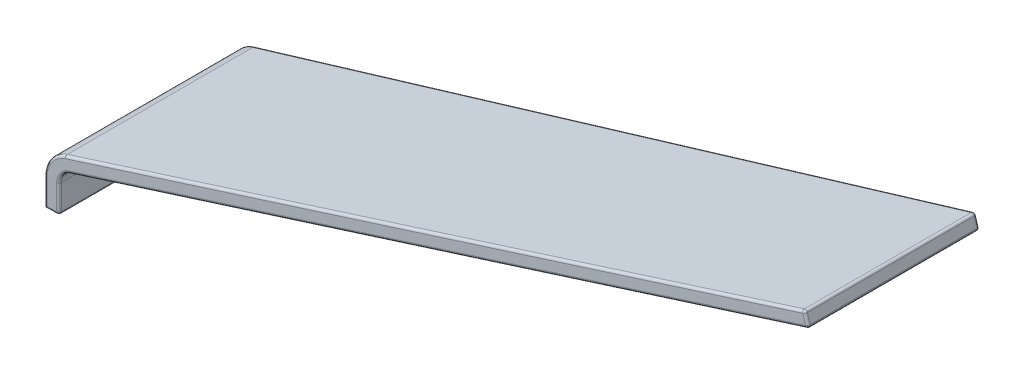
ISO-10303-21;
HEADER;
FILE_DESCRIPTION(('STEP AP214'),'2;1');
FILE_NAME('part.step','',(''),(''),'','','');
FILE_SCHEMA(('AUTOMOTIVE_DESIGN { 1 0 10303 214 1 1 1 1 }'));
ENDSEC;
DATA;
#1=APPLICATION_CONTEXT('core data for automotive mechanical design processes');
#2=APPLICATION_PROTOCOL_DEFINITION('international standard','automotive_design',2000,#1);
#3=PRODUCT_CONTEXT('',#1,'mechanical');
#4=PRODUCT('Part','Part','',(#3));
#5=PRODUCT_RELATED_PRODUCT_CATEGORY('part','',(#4));
#6=PRODUCT_DEFINITION_FORMATION('','',#4);
#7=PRODUCT_DEFINITION_CONTEXT('part definition',#1,'design');
#8=PRODUCT_DEFINITION('design','',#6,#7);
#9=PRODUCT_DEFINITION_SHAPE('','',#8);
#10=(LENGTH_UNIT() NAMED_UNIT(*) SI_UNIT(.MILLI.,.METRE.));
#11=(NAMED_UNIT(*) PLANE_ANGLE_UNIT() SI_UNIT($,.RADIAN.));
#12=(NAMED_UNIT(*) SI_UNIT($,.STERADIAN.) SOLID_ANGLE_UNIT());
#13=UNCERTAINTY_MEASURE_WITH_UNIT(LENGTH_MEASURE(1.E-05),#10,'distance_accuracy_value','');
#14=(GEOMETRIC_REPRESENTATION_CONTEXT(3) GLOBAL_UNCERTAINTY_ASSIGNED_CONTEXT((#13)) GLOBAL_UNIT_ASSIGNED_CONTEXT((#10,
#11,#12)) REPRESENTATION_CONTEXT('',''));
#15=CARTESIAN_POINT('',(0.,0.,0.));
#16=DIRECTION('',(0.,0.,1.));
#17=DIRECTION('',(1.,0.,0.));
#18=AXIS2_PLACEMENT_3D('',#15,#16,#17);
#19=CARTESIAN_POINT('',(-0.25,5.9,-1.94936097891246));
#20=DIRECTION('',(0.,-1.,0.));
#21=DIRECTION('',(1.,0.,0.));
#22=AXIS2_PLACEMENT_3D('',#19,#20,#21);
#23=CYLINDRICAL_SURFACE('',#22,0.05);
#24=CARTESIAN_POINT('',(-0.25,0.,-1.94936097891246));
#25=DIRECTION('',(0.,-1.,0.));
#26=DIRECTION('',(-1.,0.,0.));
#27=AXIS2_PLACEMENT_3D('',#24,#25,#26);
#28=CIRCLE('',#27,0.05);
#29=CARTESIAN_POINT('',(-0.3,0.,-1.94936097891246));
#30=VERTEX_POINT('',#29);
#31=CARTESIAN_POINT('',(-0.249365062062698,0.,-1.99935694728808));
#32=VERTEX_POINT('',#31);
#33=EDGE_CURVE('E337',#30,#32,#28,.T.);
#34=ORIENTED_EDGE('',*,*,#33,.F.);
#35=DIRECTION('',(0.,-1.,0.));
#36=VECTOR('',#35,1.);
#37=CARTESIAN_POINT('',(-0.3,0.,-1.94936097891246));
#38=LINE('',#37,#36);
#39=CARTESIAN_POINT('',(-0.3,0.578874053676874,-1.94936097891246));
#40=VERTEX_POINT('',#39);
#41=EDGE_CURVE('E330',#40,#30,#38,.T.);
#42=ORIENTED_EDGE('',*,*,#41,.F.);
#43=CARTESIAN_POINT('',(-0.25,0.578874053676874,-1.94936097891246));
#44=DIRECTION('',(0.,-1.,0.));
#45=DIRECTION('',(0.,0.,-1.));
#46=AXIS2_PLACEMENT_3D('',#43,#44,#45);
#47=CIRCLE('',#46,0.05);
#48=CARTESIAN_POINT('',(-0.249365062062698,0.578874053676874,-1.99935694728808));
#49=VERTEX_POINT('',#48);
#50=EDGE_CURVE('E11',#40,#49,#47,.T.);
#51=ORIENTED_EDGE('',*,*,#50,.T.);
#52=DIRECTION('',(0.,1.,0.));
#53=VECTOR('',#52,1.);
#54=CARTESIAN_POINT('',(-0.249365062062698,0.578874053676874,-1.99935694728808));
#55=LINE('',#54,#53);
#56=EDGE_CURVE('E290',#32,#49,#55,.T.);
#57=ORIENTED_EDGE('',*,*,#56,.F.);
#58=EDGE_LOOP('',(#34,#42,#51,#57));
#59=FACE_BOUND('',#58,.T.);
#60=ADVANCED_FACE('F17',(#59),#23,.T.);
#61=CARTESIAN_POINT('',(-0.3,0.578874053676874,-1.94936097891246));
#62=CARTESIAN_POINT('',(-0.299999999999999,0.578874053676874,-2.));
#63=CARTESIAN_POINT('',(-0.249365062062698,0.578874053676874,-1.99935694728808));
#64=CARTESIAN_POINT('',(-0.3,0.706065572382144,-1.94936097891022));
#65=CARTESIAN_POINT('',(-0.29999999980723,0.706204949173155,-1.99999999999747));
#66=CARTESIAN_POINT('',(-0.249365061887501,0.695466279156039,-1.99935694728585));
#67=CARTESIAN_POINT('',(-0.25835152249993,0.832610066563799,-1.94887612951393));
#68=CARTESIAN_POINT('',(-0.258315963316391,0.832794241448857,-1.99947062178951));
#69=CARTESIAN_POINT('',(-0.211187291020966,0.811465398823224,-1.99887209788954));
#70=CARTESIAN_POINT('',(-0.107602736688075,1.03712987301596,-1.94712119241854));
#71=CARTESIAN_POINT('',(-0.107308329334465,1.03739358029818,-1.99755285764267));
#72=CARTESIAN_POINT('',(-0.0730009040267693,0.998941888071033,-1.99711716079417));
#73=CARTESIAN_POINT('',(0.000948952192993986,1.11436089565273,-1.94585749145637));
#74=CARTESIAN_POINT('',(0.00130044328543809,1.11460506699489,-1.99617354982449));
#75=CARTESIAN_POINT('',(0.026504807763131,1.06973699103647,-1.99585345987095));
#76=CARTESIAN_POINT('',(0.122443640963793,1.1520003393817,-1.9444431149825));
#77=CARTESIAN_POINT('',(0.123025160813913,1.15218049609387,-1.99462767235518));
#78=CARTESIAN_POINT('',(0.137874942154111,1.10423981557296,-1.99443908335811));
#79=(BOUNDED_SURFACE() B_SPLINE_SURFACE(3,2,((#61,#62,#63),(#64,#65,#66),(#67,#68,#69),(#70,#71,
#72),(#73,#74,#75),(#76,#77,#78)),.UNSPECIFIED.,.F.,.F.,.F.) B_SPLINE_SURFACE_WITH_KNOTS((4,2,
4),(3,3),(0.,0.635185104833467,1.27037020966693),(0.,1.),
.UNSPECIFIED.) GEOMETRIC_REPRESENTATION_ITEM() RATIONAL_B_SPLINE_SURFACE(((1.,0.702602747380758,
1.),(1.,0.702599065790323,1.),(1.,0.70291655171101,1.),(1.,0.704050386956985,1.),(1.,
0.704865043059385,1.),(1.,0.705776909176911,1.))) REPRESENTATION_ITEM('') SURFACE());
#80=CARTESIAN_POINT('',(0.13724000421681,1.10423981557296,-1.9444431149825));
#81=DIRECTION('',(-0.955140199389065,-0.295905493087059,-0.0121300730386369));
#82=DIRECTION('',(0.295927265060347,-0.955210476174703,0.));
#83=AXIS2_PLACEMENT_3D('',#80,#81,#82);
#84=CIRCLE('',#83,0.05);
#85=CARTESIAN_POINT('',(0.122443640963793,1.1520003393817,-1.9444431149825));
#86=VERTEX_POINT('',#85);
#87=CARTESIAN_POINT('',(0.137874942154111,1.10423981557296,-1.99443908335811));
#88=VERTEX_POINT('',#87);
#89=EDGE_CURVE('E26',#86,#88,#84,.T.);
#90=CARTESIAN_POINT('',(-0.249365062062698,0.578874053676874,-1.99935694728808));
#91=CARTESIAN_POINT('',(-0.249365062062699,0.828942346174357,-1.99935694728807));
#92=CARTESIAN_POINT('',(-0.100992910598605,1.03023778969587,-1.99747265319668));
#93=CARTESIAN_POINT('',(0.137874942154111,1.10423981557296,-1.99443908335811));
#94=(BOUNDED_CURVE() B_SPLINE_CURVE(3,(#90,#91,#92,#93),.UNSPECIFIED.,.F.,
.F.) B_SPLINE_CURVE_WITH_KNOTS((4,4),(0.,1.27037020966693),
.UNSPECIFIED.) CURVE() GEOMETRIC_REPRESENTATION_ITEM() RATIONAL_B_SPLINE_CURVE((1.,
0.869974588437781,0.869974588437781,1.)) REPRESENTATION_ITEM(''));
#95=EDGE_CURVE('E291',#49,#88,#94,.T.);
#96=CARTESIAN_POINT('',(-0.3,0.578874053676874,-1.94936097891246));
#97=CARTESIAN_POINT('',(-0.3,0.706065572382144,-1.94936097891022));
#98=CARTESIAN_POINT('',(-0.25835152249993,0.832610066563799,-1.94887612951393));
#99=CARTESIAN_POINT('',(-0.107602736688075,1.03712987301596,-1.94712119241854));
#100=CARTESIAN_POINT('',(0.000948952192993986,1.11436089565273,-1.94585749145637));
#101=CARTESIAN_POINT('',(0.122443640963793,1.1520003393817,-1.9444431149825));
#102=(BOUNDED_CURVE() B_SPLINE_CURVE(3,(#96,#97,#98,#99,#100,#101),.UNSPECIFIED.,.F.,
.F.) B_SPLINE_CURVE_WITH_KNOTS((4,2,4),(0.,0.635185104833467,1.27037020966693),
.UNSPECIFIED.) CURVE() GEOMETRIC_REPRESENTATION_ITEM() RATIONAL_B_SPLINE_CURVE((1.,1.,1.,1.,1.,1.)) REPRESENTATION_ITEM(''));
#103=EDGE_CURVE('E532',#86,#40,#102,.F.);
#104=ORIENTED_EDGE('',*,*,#89,.T.);
#105=ORIENTED_EDGE('',*,*,#95,.F.);
#106=ORIENTED_EDGE('',*,*,#50,.F.);
#107=ORIENTED_EDGE('',*,*,#103,.F.);
#108=EDGE_LOOP('',(#104,#105,#106,#107));
#109=FACE_BOUND('',#108,.T.);
#110=ADVANCED_FACE('F642',(#109),#79,.T.);
#111=CARTESIAN_POINT('',(1.09313702634416,1.40037977476844,-1.9323034304595));
#112=DIRECTION('',(-0.955140199389064,-0.295905493087061,-0.012130073038637));
#113=DIRECTION('',(0.295927265060348,-0.955210476174703,0.));
#114=AXIS2_PLACEMENT_3D('',#111,#112,#113);
#115=CYLINDRICAL_SURFACE('',#114,0.05);
#116=CARTESIAN_POINT('',(15.4153367168871,5.83744311293824,-1.75041460572847));
#117=DIRECTION('',(-0.955140199389077,-0.29590549308702,-0.0121300730386477));
#118=DIRECTION('',(-0.295927265060307,0.955210476174715,0.));
#119=AXIS2_PLACEMENT_3D('',#116,#117,#118);
#120=CIRCLE('',#119,0.05);
#121=CARTESIAN_POINT('',(15.400540353634,5.88520363674698,-1.75041460572847));
#122=VERTEX_POINT('',#121);
#123=CARTESIAN_POINT('',(15.4159716548244,5.83744311293824,-1.80041057410409));
#124=VERTEX_POINT('',#123);
#125=EDGE_CURVE('E364',#122,#124,#120,.T.);
#126=ORIENTED_EDGE('',*,*,#125,.T.);
#127=DIRECTION('',(0.955140199389065,0.295905493087058,0.012130073038637));
#128=VECTOR('',#127,1.);
#129=CARTESIAN_POINT('',(15.463150658783,5.85205931947908,-1.79981141100293));
#130=LINE('',#129,#128);
#131=EDGE_CURVE('E278',#88,#124,#130,.T.);
#132=ORIENTED_EDGE('',*,*,#131,.F.);
#133=ORIENTED_EDGE('',*,*,#89,.F.);
#134=DIRECTION('',(-0.955140199389065,-0.295905493087058,-0.012130073038637));
#135=VECTOR('',#134,1.);
#136=CARTESIAN_POINT('',(0.121862121113672,1.15182018266952,-1.94445050015826));
#137=LINE('',#136,#135);
#138=EDGE_CURVE('E523',#122,#86,#137,.T.);
#139=ORIENTED_EDGE('',*,*,#138,.F.);
#140=EDGE_LOOP('',(#126,#132,#133,#139));
#141=FACE_BOUND('',#140,.T.);
#142=ADVANCED_FACE('F647',(#141),#115,.T.);
#143=CARTESIAN_POINT('',(15.4153367168871,5.83744311293824,-1.75041460572847));
#144=DIRECTION('',(0.,0.,1.));
#145=DIRECTION('',(-0.955210476174704,-0.295927265060344,0.));
#146=AXIS2_PLACEMENT_3D('',#143,#144,#145);
#147=SPHERICAL_SURFACE('',#146,0.05);
#148=CARTESIAN_POINT('',(15.4153367168871,5.83744311293824,-1.75041460572847));
#149=DIRECTION('',(0.,0.,-1.));
#150=DIRECTION('',(-1.,0.,0.));
#151=AXIS2_PLACEMENT_3D('',#148,#149,#150);
#152=CIRCLE('',#151,0.05);
#153=CARTESIAN_POINT('',(15.4630972406958,5.85223947619126,-1.75041460572847));
#154=VERTEX_POINT('',#153);
#155=EDGE_CURVE('E358',#122,#154,#152,.T.);
#156=ORIENTED_EDGE('',*,*,#155,.T.);
#157=CARTESIAN_POINT('',(15.4153367168871,5.83744311293824,-1.75041460572847));
#158=DIRECTION('',(-0.295925175220864,0.955203730474661,-0.00375818543885566));
#159=DIRECTION('',(-0.955210476174704,-0.295927265060344,0.));
#160=AXIS2_PLACEMENT_3D('',#157,#158,#159);
#161=CIRCLE('',#160,0.05);
#162=EDGE_CURVE('E365',#154,#124,#161,.T.);
#163=ORIENTED_EDGE('',*,*,#162,.T.);
#164=ORIENTED_EDGE('',*,*,#125,.F.);
#165=EDGE_LOOP('',(#156,#163,#164));
#166=FACE_BOUND('',#165,.T.);
#167=ADVANCED_FACE('F415',(#166),#147,.T.);
#168=CARTESIAN_POINT('',(15.4153367168871,5.83744311293824,2.));
#169=DIRECTION('',(0.,0.,1.));
#170=DIRECTION('',(1.,0.,0.));
#171=AXIS2_PLACEMENT_3D('',#168,#169,#170);
#172=CYLINDRICAL_SURFACE('',#171,0.05);
#173=CARTESIAN_POINT('',(15.4153367168871,5.83744311293824,1.75041460572847));
#174=DIRECTION('',(0.,0.,-1.));
#175=DIRECTION('',(0.,-1.,0.));
#176=AXIS2_PLACEMENT_3D('',#173,#174,#175);
#177=CIRCLE('',#176,0.05);
#178=CARTESIAN_POINT('',(15.400540353634,5.88520363674698,1.75041460572847));
#179=VERTEX_POINT('',#178);
#180=CARTESIAN_POINT('',(15.4630972406958,5.85223947619126,1.75041460572847));
#181=VERTEX_POINT('',#180);
#182=EDGE_CURVE('E385',#179,#181,#177,.T.);
#183=ORIENTED_EDGE('',*,*,#182,.T.);
#184=DIRECTION('',(0.,0.,1.));
#185=VECTOR('',#184,1.);
#186=CARTESIAN_POINT('',(15.4630972406958,5.85223947619126,2.));
#187=LINE('',#186,#185);
#188=EDGE_CURVE('E272',#154,#181,#187,.T.);
#189=ORIENTED_EDGE('',*,*,#188,.F.);
#190=ORIENTED_EDGE('',*,*,#155,.F.);
#191=DIRECTION('',(0.,0.,-1.));
#192=VECTOR('',#191,1.);
#193=CARTESIAN_POINT('',(15.400540353634,5.88520363674698,2.));
#194=LINE('',#193,#192);
#195=EDGE_CURVE('E670',#179,#122,#194,.T.);
#196=ORIENTED_EDGE('',*,*,#195,.F.);
#197=EDGE_LOOP('',(#183,#189,#190,#196));
#198=FACE_BOUND('',#197,.T.);
#199=ADVANCED_FACE('F693',(#198),#172,.T.);
#200=CARTESIAN_POINT('',(14.0211573614235,10.3376527361837,-1.76812038067287));
#201=DIRECTION('',(-0.295925175220864,0.955203730474661,-0.00375818543884609));
#202=DIRECTION('',(-0.955210476174704,-0.295927265060344,0.));
#203=AXIS2_PLACEMENT_3D('',#200,#201,#202);
#204=CYLINDRICAL_SURFACE('',#203,0.05);
#205=CARTESIAN_POINT('',(15.4745221698991,5.6464010177033,-1.7496629633326));
#206=DIRECTION('',(-0.295925175220848,0.955203730474666,-0.00375818543884923));
#207=DIRECTION('',(0.955210476174709,0.295927265060328,0.));
#208=AXIS2_PLACEMENT_3D('',#205,#206,#207);
#209=CIRCLE('',#208,0.05);
#210=CARTESIAN_POINT('',(15.5222826937079,5.66119738095632,-1.7496629633326));
#211=VERTEX_POINT('',#210);
#212=CARTESIAN_POINT('',(15.4751571078365,5.6464010177033,-1.79965893170822));
#213=VERTEX_POINT('',#212);
#214=EDGE_CURVE('E384',#211,#213,#209,.T.);
#215=ORIENTED_EDGE('',*,*,#214,.T.);
#216=DIRECTION('',(0.295925175220864,-0.955203730474661,0.00375818543884609));
#217=VECTOR('',#216,1.);
#218=CARTESIAN_POINT('',(15.4898985340888,5.59881782259928,-1.79947171879722));
#219=LINE('',#218,#217);
#220=EDGE_CURVE('E273',#124,#213,#219,.T.);
#221=ORIENTED_EDGE('',*,*,#220,.F.);
#222=ORIENTED_EDGE('',*,*,#162,.F.);
#223=DIRECTION('',(-0.295925175220864,0.955203730474661,-0.00375818543884609));
#224=VECTOR('',#223,1.);
#225=CARTESIAN_POINT('',(15.4482459404421,5.9001773287047,-1.75060321401541));
#226=LINE('',#225,#224);
#227=EDGE_CURVE('E262',#211,#154,#226,.T.);
#228=ORIENTED_EDGE('',*,*,#227,.F.);
#229=EDGE_LOOP('',(#215,#221,#222,#228));
#230=FACE_BOUND('',#229,.T.);
#231=ADVANCED_FACE('F696',(#230),#204,.T.);
#232=CARTESIAN_POINT('',(15.4153367168871,5.83744311293824,1.75041460572847));
#233=DIRECTION('',(0.,0.,1.));
#234=DIRECTION('',(-0.955210476174704,-0.295927265060344,0.));
#235=AXIS2_PLACEMENT_3D('',#232,#233,#234);
#236=SPHERICAL_SURFACE('',#235,0.05);
#237=CARTESIAN_POINT('',(15.4153367168871,5.83744311293824,1.75041460572847));
#238=DIRECTION('',(0.955140199389066,0.295905493087056,-0.0121300730386092));
#239=DIRECTION('',(-0.295927265060344,0.955210476174704,0.));
#240=AXIS2_PLACEMENT_3D('',#237,#238,#239);
#241=CIRCLE('',#240,0.05);
#242=CARTESIAN_POINT('',(15.4159716548244,5.83744311293824,1.80041057410409));
#243=VERTEX_POINT('',#242);
#244=EDGE_CURVE('E381',#179,#243,#241,.T.);
#245=ORIENTED_EDGE('',*,*,#244,.T.);
#246=CARTESIAN_POINT('',(15.4153367168871,5.83744311293824,1.75041460572847));
#247=DIRECTION('',(-0.295925175220864,0.955203730474661,0.00375818543884943));
#248=DIRECTION('',(-0.955210476174704,-0.295927265060344,0.));
#249=AXIS2_PLACEMENT_3D('',#246,#247,#248);
#250=CIRCLE('',#249,0.05);
#251=EDGE_CURVE('E377',#243,#181,#250,.T.);
#252=ORIENTED_EDGE('',*,*,#251,.T.);
#253=ORIENTED_EDGE('',*,*,#182,.F.);
#254=EDGE_LOOP('',(#245,#252,#253));
#255=FACE_BOUND('',#254,.T.);
#256=ADVANCED_FACE('F700',(#255),#236,.T.);
#257=CARTESIAN_POINT('',(15.4745221698991,5.6464010177033,-1.7496629633326));
#258=DIRECTION('',(0.,0.,1.));
#259=DIRECTION('',(0.955210476174694,0.295927265060375,0.));
#260=AXIS2_PLACEMENT_3D('',#257,#258,#259);
#261=SPHERICAL_SURFACE('',#260,0.05);
#262=CARTESIAN_POINT('',(15.4745221698991,5.6464010177033,-1.7496629633326));
#263=DIRECTION('',(0.,0.,-1.));
#264=DIRECTION('',(-1.,0.,0.));
#265=AXIS2_PLACEMENT_3D('',#262,#263,#264);
#266=CIRCLE('',#265,0.05);
#267=CARTESIAN_POINT('',(15.5245221698992,5.6464010177033,-1.7496629633326));
#268=VERTEX_POINT('',#267);
#269=EDGE_CURVE('E374',#211,#268,#266,.T.);
#270=ORIENTED_EDGE('',*,*,#269,.T.);
#271=CARTESIAN_POINT('',(15.4745221698991,5.6464010177033,-1.7496629633326));
#272=DIRECTION('',(0.,0.,-1.));
#273=DIRECTION('',(-1.,0.,0.));
#274=AXIS2_PLACEMENT_3D('',#271,#272,#273);
#275=CIRCLE('',#274,0.05);
#276=CARTESIAN_POINT('',(15.4893185331522,5.59864049389457,-1.7496629633326));
#277=VERTEX_POINT('',#276);
#278=EDGE_CURVE('E772',#268,#277,#275,.T.);
#279=ORIENTED_EDGE('',*,*,#278,.T.);
#280=CARTESIAN_POINT('',(15.4745221698991,5.6464010177033,-1.7496629633326));
#281=DIRECTION('',(0.955140199389066,0.295905493087056,0.0121300730385762));
#282=DIRECTION('',(-0.295927265060344,0.955210476174704,0.));
#283=AXIS2_PLACEMENT_3D('',#280,#281,#282);
#284=CIRCLE('',#283,0.05);
#285=EDGE_CURVE('E370',#277,#213,#284,.T.);
#286=ORIENTED_EDGE('',*,*,#285,.T.);
#287=ORIENTED_EDGE('',*,*,#214,.F.);
#288=EDGE_LOOP('',(#270,#279,#286,#287));
#289=FACE_BOUND('',#288,.T.);
#290=ADVANCED_FACE('F704',(#289),#261,.T.);
#291=CARTESIAN_POINT('',(1.09313702634416,1.40037977476844,1.9323034304595));
#292=DIRECTION('',(0.955140199389064,0.295905493087061,-0.012130073038637));
#293=DIRECTION('',(-0.295927265060348,0.955210476174703,0.));
#294=AXIS2_PLACEMENT_3D('',#291,#292,#293);
#295=CYLINDRICAL_SURFACE('',#294,0.05);
#296=CARTESIAN_POINT('',(0.13724000421681,1.10423981557296,1.9444431149825));
#297=DIRECTION('',(0.955140199389065,0.295905493087059,-0.0121300730386369));
#298=DIRECTION('',(-0.295927265060347,0.955210476174703,0.));
#299=AXIS2_PLACEMENT_3D('',#296,#297,#298);
#300=CIRCLE('',#299,0.05);
#301=CARTESIAN_POINT('',(0.122443640963793,1.1520003393817,1.9444431149825));
#302=VERTEX_POINT('',#301);
#303=CARTESIAN_POINT('',(0.137874942154111,1.10423981557296,1.99443908335811));
#304=VERTEX_POINT('',#303);
#305=EDGE_CURVE('E318',#302,#304,#300,.T.);
#306=ORIENTED_EDGE('',*,*,#305,.T.);
#307=DIRECTION('',(-0.955140199389065,-0.295905493087058,0.012130073038637));
#308=VECTOR('',#307,1.);
#309=CARTESIAN_POINT('',(0.13729342230399,1.10405965886078,1.99444646853388));
#310=LINE('',#309,#308);
#311=EDGE_CURVE('E256',#243,#304,#310,.T.);
#312=ORIENTED_EDGE('',*,*,#311,.F.);
#313=ORIENTED_EDGE('',*,*,#244,.F.);
#314=DIRECTION('',(0.955140199389065,0.295905493087058,-0.012130073038637));
#315=VECTOR('',#314,1.);
#316=CARTESIAN_POINT('',(15.4477193575927,5.89981984328782,1.74981544262731));
#317=LINE('',#316,#315);
#318=EDGE_CURVE('E512',#302,#179,#317,.T.);
#319=ORIENTED_EDGE('',*,*,#318,.F.);
#320=EDGE_LOOP('',(#306,#312,#313,#319));
#321=FACE_BOUND('',#320,.T.);
#322=ADVANCED_FACE('F708',(#321),#295,.T.);
#323=CARTESIAN_POINT('',(14.0211573614235,10.3376527361837,1.76812038067287));
#324=DIRECTION('',(0.295925175220864,-0.955203730474661,-0.00375818543884609));
#325=DIRECTION('',(0.955210476174704,0.295927265060344,0.));
#326=AXIS2_PLACEMENT_3D('',#323,#324,#325);
#327=CYLINDRICAL_SURFACE('',#326,0.05);
#328=CARTESIAN_POINT('',(15.4745221698991,5.6464010177033,1.7496629633326));
#329=DIRECTION('',(-0.295925175220864,0.955203730474661,0.00375818543883909));
#330=DIRECTION('',(0.955210476174704,0.295927265060344,0.));
#331=AXIS2_PLACEMENT_3D('',#328,#329,#330);
#332=CIRCLE('',#331,0.05);
#333=CARTESIAN_POINT('',(15.4751571078365,5.6464010177033,1.79965893170822));
#334=VERTEX_POINT('',#333);
#335=CARTESIAN_POINT('',(15.5222826937079,5.66119738095632,1.7496629633326));
#336=VERTEX_POINT('',#335);
#337=EDGE_CURVE('E263',#334,#336,#332,.T.);
#338=ORIENTED_EDGE('',*,*,#337,.T.);
#339=DIRECTION('',(0.295925175220864,-0.955203730474661,-0.00375818543884609));
#340=VECTOR('',#339,1.);
#341=CARTESIAN_POINT('',(15.5370241199602,5.61361418585229,1.74947575042161));
#342=LINE('',#341,#340);
#343=EDGE_CURVE('E282',#181,#336,#342,.T.);
#344=ORIENTED_EDGE('',*,*,#343,.F.);
#345=ORIENTED_EDGE('',*,*,#251,.F.);
#346=DIRECTION('',(-0.295925175220864,0.955203730474661,0.00375818543884609));
#347=VECTOR('',#346,1.);
#348=CARTESIAN_POINT('',(15.4011203545706,5.88538096545169,1.80059918239103));
#349=LINE('',#348,#347);
#350=EDGE_CURVE('E720',#334,#243,#349,.T.);
#351=ORIENTED_EDGE('',*,*,#350,.F.);
#352=EDGE_LOOP('',(#338,#344,#345,#351));
#353=FACE_BOUND('',#352,.T.);
#354=ADVANCED_FACE('F467',(#353),#327,.T.);
#355=CARTESIAN_POINT('',(15.4745221698991,5.6464010177033,2.));
#356=DIRECTION('',(0.,0.,1.));
#357=DIRECTION('',(1.,0.,0.));
#358=AXIS2_PLACEMENT_3D('',#355,#356,#357);
#359=CYLINDRICAL_SURFACE('',#358,0.05);
#360=DIRECTION('',(0.,0.,1.));
#361=VECTOR('',#360,1.);
#362=CARTESIAN_POINT('',(15.5245221698992,5.6464010177033,2.));
#363=LINE('',#362,#361);
#364=CARTESIAN_POINT('',(15.5245221698992,5.6464010177033,1.7496629633326));
#365=VERTEX_POINT('',#364);
#366=EDGE_CURVE('E731',#268,#365,#363,.T.);
#367=ORIENTED_EDGE('',*,*,#366,.F.);
#368=ORIENTED_EDGE('',*,*,#269,.F.);
#369=DIRECTION('',(0.,0.,-1.));
#370=VECTOR('',#369,1.);
#371=CARTESIAN_POINT('',(15.5222826937079,5.66119738095632,2.));
#372=LINE('',#371,#370);
#373=EDGE_CURVE('E258',#336,#211,#372,.T.);
#374=ORIENTED_EDGE('',*,*,#373,.F.);
#375=CARTESIAN_POINT('',(15.4745221698991,5.6464010177033,1.7496629633326));
#376=DIRECTION('',(0.,0.,-1.));
#377=DIRECTION('',(1.,2.25514051876986E-13,0.));
#378=AXIS2_PLACEMENT_3D('',#375,#376,#377);
#379=CIRCLE('',#378,0.05);
#380=EDGE_CURVE('E267',#336,#365,#379,.T.);
#381=ORIENTED_EDGE('',*,*,#380,.T.);
#382=EDGE_LOOP('',(#367,#368,#374,#381));
#383=FACE_BOUND('',#382,.T.);
#384=ADVANCED_FACE('F463',(#383),#359,.T.);
#385=CARTESIAN_POINT('',(1.15231377088728,1.20933498162193,-1.93155189865928));
#386=DIRECTION('',(0.955140199389064,0.295905493087061,0.012130073038637));
#387=DIRECTION('',(-0.295927265060348,0.955210476174703,0.));
#388=AXIS2_PLACEMENT_3D('',#385,#386,#387);
#389=CYLINDRICAL_SURFACE('',#388,0.05);
#390=CARTESIAN_POINT('',(0.196425457228879,0.913197720338019,-1.94369147258663));
#391=DIRECTION('',(0.955140199389065,0.295905493087057,0.0121300730386372));
#392=DIRECTION('',(-0.295927265060346,0.955210476174704,0.));
#393=AXIS2_PLACEMENT_3D('',#390,#391,#392);
#394=CIRCLE('',#393,0.05);
#395=CARTESIAN_POINT('',(0.211221820481897,0.865437196529284,-1.94369147258663));
#396=VERTEX_POINT('',#395);
#397=CARTESIAN_POINT('',(0.197060395166181,0.913197720338019,-1.99368744096224));
#398=VERTEX_POINT('',#397);
#399=EDGE_CURVE('E268',#396,#398,#394,.T.);
#400=ORIENTED_EDGE('',*,*,#399,.T.);
#401=DIRECTION('',(-0.955140199389065,-0.295905493087058,-0.012130073038637));
#402=VECTOR('',#401,1.);
#403=CARTESIAN_POINT('',(0.196483229550532,0.91301891258163,-1.99369477084018));
#404=LINE('',#403,#402);
#405=EDGE_CURVE('E277',#213,#398,#404,.T.);
#406=ORIENTED_EDGE('',*,*,#405,.F.);
#407=ORIENTED_EDGE('',*,*,#285,.F.);
#408=DIRECTION('',(0.955140199389065,0.295905493087058,0.012130073038637));
#409=VECTOR('',#408,1.);
#410=CARTESIAN_POINT('',(15.5365018913453,5.61325804939119,-1.74906374493361));
#411=LINE('',#410,#409);
#412=EDGE_CURVE('E567',#396,#277,#411,.T.);
#413=ORIENTED_EDGE('',*,*,#412,.F.);
#414=EDGE_LOOP('',(#400,#406,#407,#413));
#415=FACE_BOUND('',#414,.T.);
#416=ADVANCED_FACE('F466',(#415),#389,.T.);
#417=CARTESIAN_POINT('',(0.122443640963793,1.1520003393817,1.9444431149825));
#418=CARTESIAN_POINT('',(0.123025160813913,1.15218049609387,1.99462767235518));
#419=CARTESIAN_POINT('',(0.137874942154111,1.10423981557296,1.99443908335811));
#420=CARTESIAN_POINT('',(0.000948952192995531,1.11436089565273,1.94585749145637));
#421=CARTESIAN_POINT('',(0.00130044328542074,1.11460506699494,1.99617354982449));
#422=CARTESIAN_POINT('',(0.0265048077631287,1.06973699103647,1.99585345987095));
#423=CARTESIAN_POINT('',(-0.107602736688076,1.03712987301596,1.94712119241854));
#424=CARTESIAN_POINT('',(-0.107308329334459,1.03739358029817,1.99755285764267));
#425=CARTESIAN_POINT('',(-0.0730009040267655,0.998941888071032,1.99711716079417));
#426=CARTESIAN_POINT('',(-0.25835152249993,0.832610066563799,1.94887612951393));
#427=CARTESIAN_POINT('',(-0.258315963316398,0.832794241448864,1.99947062178951));
#428=CARTESIAN_POINT('',(-0.211187291020971,0.811465398823224,1.99887209788954));
#429=CARTESIAN_POINT('',(-0.3,0.706065572382143,1.94936097891022));
#430=CARTESIAN_POINT('',(-0.299999999807202,0.706204949173147,1.9999999999975));
#431=CARTESIAN_POINT('',(-0.249365061887502,0.69546627915604,1.99935694728585));
#432=CARTESIAN_POINT('',(-0.3,0.578874053676874,1.94936097891246));
#433=CARTESIAN_POINT('',(-0.3,0.578874053676873,2.));
#434=CARTESIAN_POINT('',(-0.249365062062698,0.578874053676874,1.99935694728808));
#435=(BOUNDED_SURFACE() B_SPLINE_SURFACE(3,2,((#417,#418,#419),(#420,#421,#422),(#423,#424,
#425),(#426,#427,#428),(#429,#430,#431),(#432,#433,#434)),.UNSPECIFIED.,.F.,.F.,
.F.) B_SPLINE_SURFACE_WITH_KNOTS((4,2,4),(3,3),(1.87122244392286,2.50640754875633,
3.1415926535898),(0.,1.),
.UNSPECIFIED.) GEOMETRIC_REPRESENTATION_ITEM() RATIONAL_B_SPLINE_SURFACE(((1.,0.70577690917691,
1.),(1.,0.704865043059386,1.),(1.,0.704050386956986,1.),(1.,0.70291655171101,1.),(1.,
0.702599065790326,1.),(1.,0.702602747380757,1.))) REPRESENTATION_ITEM('') SURFACE());
#436=CARTESIAN_POINT('',(-0.25,0.578874053676874,1.94936097891246));
#437=DIRECTION('',(0.,1.,0.));
#438=DIRECTION('',(0.,0.,1.));
#439=AXIS2_PLACEMENT_3D('',#436,#437,#438);
#440=CIRCLE('',#439,0.05);
#441=CARTESIAN_POINT('',(-0.3,0.578874053676874,1.94936097891246));
#442=VERTEX_POINT('',#441);
#443=CARTESIAN_POINT('',(-0.249365062062698,0.578874053676874,1.99935694728808));
#444=VERTEX_POINT('',#443);
#445=EDGE_CURVE('E369',#442,#444,#440,.T.);
#446=CARTESIAN_POINT('',(0.137874942154111,1.10423981557296,1.99443908335811));
#447=CARTESIAN_POINT('',(-0.100992910598605,1.03023778969587,1.99747265319668));
#448=CARTESIAN_POINT('',(-0.249365062062699,0.828942346174357,1.99935694728807));
#449=CARTESIAN_POINT('',(-0.249365062062698,0.578874053676874,1.99935694728808));
#450=(BOUNDED_CURVE() B_SPLINE_CURVE(3,(#446,#447,#448,#449),.UNSPECIFIED.,.F.,
.F.) B_SPLINE_CURVE_WITH_KNOTS((4,4),(1.87122244392286,3.1415926535898),
.UNSPECIFIED.) CURVE() GEOMETRIC_REPRESENTATION_ITEM() RATIONAL_B_SPLINE_CURVE((1.,
0.869974588437781,0.869974588437781,1.)) REPRESENTATION_ITEM(''));
#451=EDGE_CURVE('E253',#304,#444,#450,.T.);
#452=CARTESIAN_POINT('',(0.122443640963793,1.1520003393817,1.9444431149825));
#453=CARTESIAN_POINT('',(0.000948952192995531,1.11436089565273,1.94585749145637));
#454=CARTESIAN_POINT('',(-0.107602736688076,1.03712987301596,1.94712119241854));
#455=CARTESIAN_POINT('',(-0.25835152249993,0.832610066563799,1.94887612951393));
#456=CARTESIAN_POINT('',(-0.3,0.706065572382143,1.94936097891022));
#457=CARTESIAN_POINT('',(-0.3,0.578874053676874,1.94936097891246));
#458=(BOUNDED_CURVE() B_SPLINE_CURVE(3,(#452,#453,#454,#455,#456,#457),.UNSPECIFIED.,.F.,
.F.) B_SPLINE_CURVE_WITH_KNOTS((4,2,4),(1.87122244392286,2.50640754875633,3.1415926535898),
.UNSPECIFIED.) CURVE() GEOMETRIC_REPRESENTATION_ITEM() RATIONAL_B_SPLINE_CURVE((1.,1.,1.,1.,1.,1.)) REPRESENTATION_ITEM(''));
#459=EDGE_CURVE('E563',#442,#302,#458,.F.);
#460=ORIENTED_EDGE('',*,*,#445,.T.);
#461=ORIENTED_EDGE('',*,*,#451,.F.);
#462=ORIENTED_EDGE('',*,*,#305,.F.);
#463=ORIENTED_EDGE('',*,*,#459,.F.);
#464=EDGE_LOOP('',(#460,#461,#462,#463));
#465=FACE_BOUND('',#464,.T.);
#466=ADVANCED_FACE('F461',(#465),#435,.T.);
#467=CARTESIAN_POINT('',(15.4745221698991,5.6464010177033,1.7496629633326));
#468=DIRECTION('',(0.,0.,1.));
#469=DIRECTION('',(0.955210476174694,0.295927265060375,0.));
#470=AXIS2_PLACEMENT_3D('',#467,#468,#469);
#471=SPHERICAL_SURFACE('',#470,0.05);
#472=ORIENTED_EDGE('',*,*,#337,.F.);
#473=CARTESIAN_POINT('',(15.4745221698991,5.6464010177033,1.7496629633326));
#474=DIRECTION('',(0.955140199389044,0.295905493087124,-0.0121300730386473));
#475=DIRECTION('',(-0.295927265060412,0.955210476174683,0.));
#476=AXIS2_PLACEMENT_3D('',#473,#474,#475);
#477=CIRCLE('',#476,0.05);
#478=CARTESIAN_POINT('',(15.4893185331522,5.59864049389457,1.7496629633326));
#479=VERTEX_POINT('',#478);
#480=EDGE_CURVE('E366',#334,#479,#477,.T.);
#481=ORIENTED_EDGE('',*,*,#480,.T.);
#482=CARTESIAN_POINT('',(15.4745221698991,5.6464010177033,1.7496629633326));
#483=DIRECTION('',(0.,0.,-1.));
#484=DIRECTION('',(1.,0.,0.));
#485=AXIS2_PLACEMENT_3D('',#482,#483,#484);
#486=CIRCLE('',#485,0.05);
#487=EDGE_CURVE('E765',#365,#479,#486,.T.);
#488=ORIENTED_EDGE('',*,*,#487,.F.);
#489=ORIENTED_EDGE('',*,*,#380,.F.);
#490=EDGE_LOOP('',(#472,#481,#488,#489));
#491=FACE_BOUND('',#490,.T.);
#492=ADVANCED_FACE('F451',(#491),#471,.T.);
#493=CARTESIAN_POINT('',(-0.0493650620626987,0.578874053676873,-1.99681699073586));
#494=CARTESIAN_POINT('',(0.,0.578874053676872,-1.99619006517167));
#495=CARTESIAN_POINT('',(0.,0.578874053676873,-1.94682102236024));
#496=CARTESIAN_POINT('',(-0.0493650611783317,0.730540905763355,-1.99681699072462));
#497=CARTESIAN_POINT('',(7.70711736560361E-10,0.709189781018328,-1.99619006516193));
#498=CARTESIAN_POINT('',(0.,0.708874216134504,-1.94682102234904));
#499=CARTESIAN_POINT('',(0.0521865838747763,0.868315348643161,-1.99552730689342));
#500=CARTESIAN_POINT('',(0.0877738101632125,0.827466034817703,-1.99507535685048));
#501=CARTESIAN_POINT('',(0.0870442502574118,0.826966587532687,-1.94553133877652));
#502=CARTESIAN_POINT('',(0.197060395166181,0.913197720338019,-1.99368744096224));
#503=CARTESIAN_POINT('',(0.21179898609754,0.865616004285674,-1.99350026405921));
#504=CARTESIAN_POINT('',(0.211221820481897,0.865437196529284,-1.94369147258663));
#505=(BOUNDED_SURFACE() B_SPLINE_SURFACE(3,2,((#493,#494,#495),(#496,#497,#498),(#499,#500,
#501),(#502,#503,#504)),.UNSPECIFIED.,.F.,.F.,.F.) B_SPLINE_SURFACE_WITH_KNOTS((4,4),(3,3),(0.,
1.27037020966693),(0.,1.),
.UNSPECIFIED.) GEOMETRIC_REPRESENTATION_ITEM() RATIONAL_B_SPLINE_SURFACE(((1.,0.711582306815603,
1.),(1.,0.711611183438836,1.),(1.,0.710271938354507,1.),(1.,0.708434156765952,1.))) REPRESENTATION_ITEM('') SURFACE());
#506=CARTESIAN_POINT('',(-0.05,0.578874053676873,-1.94682102236024));
#507=DIRECTION('',(0.,1.,0.));
#508=DIRECTION('',(0.,0.,1.));
#509=AXIS2_PLACEMENT_3D('',#506,#507,#508);
#510=CIRCLE('',#509,0.05);
#511=CARTESIAN_POINT('',(0.,0.578874053676873,-1.94682102236024));
#512=VERTEX_POINT('',#511);
#513=CARTESIAN_POINT('',(-0.0493650620626987,0.578874053676873,-1.99681699073586));
#514=VERTEX_POINT('',#513);
#515=EDGE_CURVE('E51',#512,#514,#510,.T.);
#516=CARTESIAN_POINT('',(0.197060395166181,0.913197720338019,-1.99368744096224));
#517=CARTESIAN_POINT('',(0.0450535797780885,0.866105522052597,-1.99561789449587));
#518=CARTESIAN_POINT('',(-0.0493650620626987,0.738008421629817,-1.99681699073585));
#519=CARTESIAN_POINT('',(-0.0493650620626987,0.578874053676873,-1.99681699073586));
#520=(BOUNDED_CURVE() B_SPLINE_CURVE(3,(#516,#517,#518,#519),.UNSPECIFIED.,.F.,
.F.) B_SPLINE_CURVE_WITH_KNOTS((4,4),(5.01281509751265,6.28318530717959),
.UNSPECIFIED.) CURVE() GEOMETRIC_REPRESENTATION_ITEM() RATIONAL_B_SPLINE_CURVE((1.,
0.869974588437781,0.869974588437781,1.)) REPRESENTATION_ITEM(''));
#521=EDGE_CURVE('E306',#398,#514,#520,.T.);
#522=CARTESIAN_POINT('',(0.211221820481897,0.865437196529284,-1.94369147258663));
#523=CARTESIAN_POINT('',(0.0870442502574118,0.826966587532687,-1.94553133877652));
#524=CARTESIAN_POINT('',(0.,0.708874216134504,-1.94682102234904));
#525=CARTESIAN_POINT('',(0.,0.578874053676873,-1.94682102236024));
#526=(BOUNDED_CURVE() B_SPLINE_CURVE(3,(#522,#523,#524,#525),.UNSPECIFIED.,.F.,
.F.) B_SPLINE_CURVE_WITH_KNOTS((4,4),(0.,1.27037020966693),
.UNSPECIFIED.) CURVE() GEOMETRIC_REPRESENTATION_ITEM() RATIONAL_B_SPLINE_CURVE((1.,1.,1.,1.)) REPRESENTATION_ITEM(''));
#527=EDGE_CURVE('E432',#512,#396,#526,.F.);
#528=ORIENTED_EDGE('',*,*,#515,.T.);
#529=ORIENTED_EDGE('',*,*,#521,.F.);
#530=ORIENTED_EDGE('',*,*,#399,.F.);
#531=ORIENTED_EDGE('',*,*,#527,.F.);
#532=EDGE_LOOP('',(#528,#529,#530,#531));
#533=FACE_BOUND('',#532,.T.);
#534=ADVANCED_FACE('F438',(#533),#505,.T.);
#535=CARTESIAN_POINT('',(-0.25,5.9,1.94936097891246));
#536=DIRECTION('',(0.,1.,0.));
#537=DIRECTION('',(-1.,0.,0.));
#538=AXIS2_PLACEMENT_3D('',#535,#536,#537);
#539=CYLINDRICAL_SURFACE('',#538,0.05);
#540=CARTESIAN_POINT('',(-0.3,0.,1.94999596805051));
#541=CARTESIAN_POINT('',(-0.299624030343212,0.,1.97928287706022));
#542=CARTESIAN_POINT('',(-0.278652022273159,0.0207106781186551,1.99972888532048));
#543=CARTESIAN_POINT('',(-0.249365062062698,0.05,1.99935694728808));
#544=(BOUNDED_CURVE() B_SPLINE_CURVE(3,(#540,#541,#542,#543),.UNSPECIFIED.,.F.,
.F.) B_SPLINE_CURVE_WITH_KNOTS((4,4),(3.1415926535898,4.71238898038468),
.UNSPECIFIED.) CURVE() GEOMETRIC_REPRESENTATION_ITEM() RATIONAL_B_SPLINE_CURVE((1.,
0.804737854124367,0.804737854124367,1.)) REPRESENTATION_ITEM(''));
#545=CARTESIAN_POINT('',(-0.3,0.,1.94999596805051));
#546=VERTEX_POINT('',#545);
#547=CARTESIAN_POINT('',(-0.249365062062698,0.05,1.99935694728808));
#548=VERTEX_POINT('',#547);
#549=EDGE_CURVE('E353',#546,#548,#544,.T.);
#550=ORIENTED_EDGE('',*,*,#549,.T.);
#551=DIRECTION('',(0.,-1.,0.));
#552=VECTOR('',#551,1.);
#553=CARTESIAN_POINT('',(-0.249365062062698,0.,1.99935694728808));
#554=LINE('',#553,#552);
#555=EDGE_CURVE('E246',#444,#548,#554,.T.);
#556=ORIENTED_EDGE('',*,*,#555,.F.);
#557=ORIENTED_EDGE('',*,*,#445,.F.);
#558=DIRECTION('',(0.,1.,0.));
#559=VECTOR('',#558,1.);
#560=CARTESIAN_POINT('',(-0.3,0.578874053676874,1.94936097891246));
#561=LINE('',#560,#559);
#562=CARTESIAN_POINT('',(-0.3,0.,1.94936097891246));
#563=VERTEX_POINT('',#562);
#564=EDGE_CURVE('E329',#563,#442,#561,.T.);
#565=ORIENTED_EDGE('',*,*,#564,.F.);
#566=DIRECTION('',(0.,0.,-1.));
#567=VECTOR('',#566,1.);
#568=CARTESIAN_POINT('',(-0.3,0.,2.));
#569=LINE('',#568,#567);
#570=EDGE_CURVE('E324',#546,#563,#569,.T.);
#571=ORIENTED_EDGE('',*,*,#570,.F.);
#572=EDGE_LOOP('',(#550,#556,#557,#565,#571));
#573=FACE_BOUND('',#572,.T.);
#574=ADVANCED_FACE('F450',(#573),#539,.T.);
#575=CARTESIAN_POINT('',(1.15231377088728,1.20933498162193,1.93155189865928));
#576=DIRECTION('',(-0.955140199389064,-0.295905493087061,0.012130073038637));
#577=DIRECTION('',(0.295927265060348,-0.955210476174703,0.));
#578=AXIS2_PLACEMENT_3D('',#575,#576,#577);
#579=CYLINDRICAL_SURFACE('',#578,0.05);
#580=CARTESIAN_POINT('',(0.196425457228879,0.913197720338019,1.94369147258663));
#581=DIRECTION('',(0.955140199389065,0.295905493087057,-0.0121300730386372));
#582=DIRECTION('',(-0.295927265060346,0.955210476174704,0.));
#583=AXIS2_PLACEMENT_3D('',#580,#581,#582);
#584=CIRCLE('',#583,0.05);
#585=CARTESIAN_POINT('',(0.197060395166181,0.913197720338019,1.99368744096224));
#586=VERTEX_POINT('',#585);
#587=CARTESIAN_POINT('',(0.211221820481897,0.865437196529284,1.94369147258663));
#588=VERTEX_POINT('',#587);
#589=EDGE_CURVE('E336',#586,#588,#584,.T.);
#590=ORIENTED_EDGE('',*,*,#589,.T.);
#591=DIRECTION('',(-0.955140199389065,-0.295905493087058,0.012130073038637));
#592=VECTOR('',#591,1.);
#593=CARTESIAN_POINT('',(0.210644654866253,0.865258388772895,1.94369880246456));
#594=LINE('',#593,#592);
#595=EDGE_CURVE('E344',#479,#588,#594,.T.);
#596=ORIENTED_EDGE('',*,*,#595,.F.);
#597=ORIENTED_EDGE('',*,*,#480,.F.);
#598=DIRECTION('',(0.955140199389065,0.295905493087058,-0.012130073038637));
#599=VECTOR('',#598,1.);
#600=CARTESIAN_POINT('',(15.5223404660296,5.66101857319993,1.79905971330922));
#601=LINE('',#600,#599);
#602=EDGE_CURVE('E516',#586,#334,#601,.T.);
#603=ORIENTED_EDGE('',*,*,#602,.F.);
#604=EDGE_LOOP('',(#590,#596,#597,#603));
#605=FACE_BOUND('',#604,.T.);
#606=ADVANCED_FACE('F452',(#605),#579,.T.);
#607=CARTESIAN_POINT('',(-0.05,5.9,-1.94682102236024));
#608=DIRECTION('',(0.,1.,0.));
#609=DIRECTION('',(0.,0.,1.));
#610=AXIS2_PLACEMENT_3D('',#607,#608,#609);
#611=CYLINDRICAL_SURFACE('',#610,0.05);
#612=CARTESIAN_POINT('',(0.,0.05,-1.94682102236024));
#613=CARTESIAN_POINT('',(0.,0.0210047218329217,-1.97581630052731));
#614=CARTESIAN_POINT('',(-0.0203721726622848,0.00037220533579222,-1.99644881702445));
#615=CARTESIAN_POINT('',(-0.0493650620626987,0.,-1.99681699073586));
#616=(BOUNDED_CURVE() B_SPLINE_CURVE(3,(#612,#613,#614,#615),.UNSPECIFIED.,.F.,
.F.) B_SPLINE_CURVE_WITH_KNOTS((4,4),(1.5707963267949,3.12889457724808),
.UNSPECIFIED.) CURVE() GEOMETRIC_REPRESENTATION_ITEM() RATIONAL_B_SPLINE_CURVE((1.,
0.807721298119402,0.807721298119402,1.)) REPRESENTATION_ITEM(''));
#617=CARTESIAN_POINT('',(0.,0.05,-1.94682102236024));
#618=VERTEX_POINT('',#617);
#619=CARTESIAN_POINT('',(-0.0493650620626987,0.,-1.99681699073586));
#620=VERTEX_POINT('',#619);
#621=EDGE_CURVE('E331',#618,#620,#616,.T.);
#622=ORIENTED_EDGE('',*,*,#621,.T.);
#623=DIRECTION('',(0.,-1.,0.));
#624=VECTOR('',#623,1.);
#625=CARTESIAN_POINT('',(-0.0493650620626987,0.,-1.99681699073586));
#626=LINE('',#625,#624);
#627=EDGE_CURVE('E307',#514,#620,#626,.T.);
#628=ORIENTED_EDGE('',*,*,#627,.F.);
#629=ORIENTED_EDGE('',*,*,#515,.F.);
#630=DIRECTION('',(0.,1.,0.));
#631=VECTOR('',#630,1.);
#632=CARTESIAN_POINT('',(0.,0.578874053676875,-1.94682102236024));
#633=LINE('',#632,#631);
#634=EDGE_CURVE('E323',#618,#512,#633,.T.);
#635=ORIENTED_EDGE('',*,*,#634,.F.);
#636=EDGE_LOOP('',(#622,#628,#629,#635));
#637=FACE_BOUND('',#636,.T.);
#638=ADVANCED_FACE('F628',(#637),#611,.T.);
#639=CARTESIAN_POINT('',(-0.3006349379373,0.05,1.95000403162438));
#640=DIRECTION('',(-0.999919367512356,0.,0.0126987587460259));
#641=DIRECTION('',(0.0126987587460259,0.,0.999919367512356));
#642=AXIS2_PLACEMENT_3D('',#639,#640,#641);
#643=CYLINDRICAL_SURFACE('',#642,0.05);
#644=CARTESIAN_POINT('',(-0.05,0.05,1.94682102236024));
#645=DIRECTION('',(-0.999919367512356,0.,0.0126987587460258));
#646=DIRECTION('',(-0.0126987587460258,0.,-0.999919367512356));
#647=AXIS2_PLACEMENT_3D('',#644,#645,#646);
#648=CIRCLE('',#647,0.05);
#649=CARTESIAN_POINT('',(-0.05,0.,1.94682102236024));
#650=VERTEX_POINT('',#649);
#651=CARTESIAN_POINT('',(-0.0493650620626987,0.05,1.99681699073586));
#652=VERTEX_POINT('',#651);
#653=EDGE_CURVE('E211',#650,#652,#648,.T.);
#654=ORIENTED_EDGE('',*,*,#653,.T.);
#655=DIRECTION('',(0.999919367512356,0.,-0.0126987587460257));
#656=VECTOR('',#655,1.);
#657=CARTESIAN_POINT('',(0.,0.05,1.99619006517167));
#658=LINE('',#657,#656);
#659=EDGE_CURVE('E215',#548,#652,#658,.T.);
#660=ORIENTED_EDGE('',*,*,#659,.F.);
#661=ORIENTED_EDGE('',*,*,#549,.F.);
#662=DIRECTION('',(-0.999919367512356,0.,0.0126987587460257));
#663=VECTOR('',#662,1.);
#664=CARTESIAN_POINT('',(-0.300634937937301,0.,1.95000403162438));
#665=LINE('',#664,#663);
#666=EDGE_CURVE('E218',#650,#546,#665,.T.);
#667=ORIENTED_EDGE('',*,*,#666,.F.);
#668=EDGE_LOOP('',(#654,#660,#661,#667));
#669=FACE_BOUND('',#668,.T.);
#670=ADVANCED_FACE('F213',(#669),#643,.T.);
#671=CARTESIAN_POINT('',(0.197060395166181,0.913197720338019,1.99368744096224));
#672=CARTESIAN_POINT('',(0.21179898609754,0.865616004285674,1.99350026405921));
#673=CARTESIAN_POINT('',(0.211221820481897,0.865437196529284,1.94369147258663));
#674=CARTESIAN_POINT('',(0.052186583874777,0.868315348643161,1.99552730689342));
#675=CARTESIAN_POINT('',(0.0877738101631918,0.827466034817766,1.99507535685031));
#676=CARTESIAN_POINT('',(0.0870442502574118,0.826966587532687,1.94553133877652));
#677=CARTESIAN_POINT('',(-0.0493650611783321,0.730540905763355,1.99681699072462));
#678=CARTESIAN_POINT('',(7.70724811059107E-10,0.70918978101828,1.99619006516186));
#679=CARTESIAN_POINT('',(0.,0.708874216134504,1.94682102234904));
#680=CARTESIAN_POINT('',(-0.0493650620626987,0.578874053676873,1.99681699073586));
#681=CARTESIAN_POINT('',(0.,0.578874053676872,1.99619006517167));
#682=CARTESIAN_POINT('',(0.,0.578874053676873,1.94682102236024));
#683=(BOUNDED_SURFACE() B_SPLINE_SURFACE(3,2,((#671,#672,#673),(#674,#675,#676),(#677,#678,
#679),(#680,#681,#682)),.UNSPECIFIED.,.F.,.F.,.F.) B_SPLINE_SURFACE_WITH_KNOTS((4,4),(3,3),
(1.87122244392286,3.1415926535898),(0.,1.),
.UNSPECIFIED.) GEOMETRIC_REPRESENTATION_ITEM() RATIONAL_B_SPLINE_SURFACE(((1.,0.708434156765952,
1.),(1.,0.710271938354511,1.),(1.,0.711611183438833,1.),(1.,0.711582306815602,1.))) REPRESENTATION_ITEM('') SURFACE());
#684=CARTESIAN_POINT('',(-0.05,0.578874053676873,1.94682102236024));
#685=DIRECTION('',(0.,1.,0.));
#686=DIRECTION('',(0.,0.,1.));
#687=AXIS2_PLACEMENT_3D('',#684,#685,#686);
#688=CIRCLE('',#687,0.05);
#689=CARTESIAN_POINT('',(-0.0493650620626987,0.578874053676873,1.99681699073586));
#690=VERTEX_POINT('',#689);
#691=CARTESIAN_POINT('',(0.,0.578874053676873,1.94682102236024));
#692=VERTEX_POINT('',#691);
#693=EDGE_CURVE('E40',#690,#692,#688,.T.);
#694=CARTESIAN_POINT('',(0.,0.578874053676873,1.94682102236024));
#695=CARTESIAN_POINT('',(0.,0.708874216134504,1.94682102234904));
#696=CARTESIAN_POINT('',(0.0870442502574118,0.826966587532687,1.94553133877652));
#697=CARTESIAN_POINT('',(0.211221820481897,0.865437196529284,1.94369147258663));
#698=(BOUNDED_CURVE() B_SPLINE_CURVE(3,(#694,#695,#696,#697),.UNSPECIFIED.,.F.,
.F.) B_SPLINE_CURVE_WITH_KNOTS((4,4),(1.87122244392286,3.1415926535898),
.UNSPECIFIED.) CURVE() GEOMETRIC_REPRESENTATION_ITEM() RATIONAL_B_SPLINE_CURVE((1.,1.,1.,1.)) REPRESENTATION_ITEM(''));
#699=EDGE_CURVE('E232',#588,#692,#698,.F.);
#700=CARTESIAN_POINT('',(-0.0493650620626987,0.578874053676873,1.99681699073586));
#701=CARTESIAN_POINT('',(-0.0493650620626987,0.738008421629817,1.99681699073585));
#702=CARTESIAN_POINT('',(0.0450535797780883,0.866105522052597,1.99561789449587));
#703=CARTESIAN_POINT('',(0.197060395166181,0.913197720338019,1.99368744096224));
#704=(BOUNDED_CURVE() B_SPLINE_CURVE(3,(#700,#701,#702,#703),.UNSPECIFIED.,.F.,
.F.) B_SPLINE_CURVE_WITH_KNOTS((4,4),(3.1415926535898,4.41196286325672),
.UNSPECIFIED.) CURVE() GEOMETRIC_REPRESENTATION_ITEM() RATIONAL_B_SPLINE_CURVE((1.,
0.869974588437781,0.869974588437781,1.)) REPRESENTATION_ITEM(''));
#705=EDGE_CURVE('E240',#690,#586,#704,.T.);
#706=ORIENTED_EDGE('',*,*,#693,.T.);
#707=ORIENTED_EDGE('',*,*,#699,.F.);
#708=ORIENTED_EDGE('',*,*,#589,.F.);
#709=ORIENTED_EDGE('',*,*,#705,.F.);
#710=EDGE_LOOP('',(#706,#707,#708,#709));
#711=FACE_BOUND('',#710,.T.);
#712=ADVANCED_FACE('F616',(#711),#683,.T.);
#713=CARTESIAN_POINT('',(-0.05,0.05,2.));
#714=DIRECTION('',(0.,0.,-1.));
#715=DIRECTION('',(-1.,0.,0.));
#716=AXIS2_PLACEMENT_3D('',#713,#714,#715);
#717=CYLINDRICAL_SURFACE('',#716,0.05);
#718=DIRECTION('',(0.,0.,1.));
#719=VECTOR('',#718,1.);
#720=CARTESIAN_POINT('',(-0.05,0.,2.));
#721=LINE('',#720,#719);
#722=CARTESIAN_POINT('',(-0.05,0.,-1.99682505430973));
#723=VERTEX_POINT('',#722);
#724=EDGE_CURVE('E343',#723,#650,#721,.T.);
#725=ORIENTED_EDGE('',*,*,#724,.F.);
#726=DIRECTION('',(-0.999919367512356,0.,-0.0126987587460227));
#727=VECTOR('',#726,1.);
#728=CARTESIAN_POINT('',(0.,0.,-1.99619006517167));
#729=LINE('',#728,#727);
#730=EDGE_CURVE('E311',#620,#723,#729,.T.);
#731=ORIENTED_EDGE('',*,*,#730,.F.);
#732=ORIENTED_EDGE('',*,*,#621,.F.);
#733=DIRECTION('',(0.,0.,-1.));
#734=VECTOR('',#733,1.);
#735=CARTESIAN_POINT('',(0.,0.05,2.));
#736=LINE('',#735,#734);
#737=CARTESIAN_POINT('',(0.,0.05,1.94682102236024));
#738=VERTEX_POINT('',#737);
#739=EDGE_CURVE('E319',#738,#618,#736,.T.);
#740=ORIENTED_EDGE('',*,*,#739,.F.);
#741=CARTESIAN_POINT('',(-0.05,0.05,1.94682102236024));
#742=DIRECTION('',(0.,0.,-1.));
#743=DIRECTION('',(1.,0.,0.));
#744=AXIS2_PLACEMENT_3D('',#741,#742,#743);
#745=CIRCLE('',#744,0.05);
#746=EDGE_CURVE('E222',#738,#650,#745,.T.);
#747=ORIENTED_EDGE('',*,*,#746,.T.);
#748=EDGE_LOOP('',(#725,#731,#732,#740,#747));
#749=FACE_BOUND('',#748,.T.);
#750=ADVANCED_FACE('F413',(#749),#717,.T.);
#751=CARTESIAN_POINT('',(-0.05,0.05,1.94682102236024));
#752=DIRECTION('',(0.,0.,1.));
#753=DIRECTION('',(1.,0.,0.));
#754=AXIS2_PLACEMENT_3D('',#751,#752,#753);
#755=SPHERICAL_SURFACE('',#754,0.05);
#756=ORIENTED_EDGE('',*,*,#653,.F.);
#757=ORIENTED_EDGE('',*,*,#746,.F.);
#758=CARTESIAN_POINT('',(-0.05,0.05,1.94682102236024));
#759=DIRECTION('',(0.,-1.,0.));
#760=DIRECTION('',(0.,0.,-1.));
#761=AXIS2_PLACEMENT_3D('',#758,#759,#760);
#762=CIRCLE('',#761,0.05);
#763=EDGE_CURVE('E225',#738,#652,#762,.T.);
#764=ORIENTED_EDGE('',*,*,#763,.T.);
#765=EDGE_LOOP('',(#756,#757,#764));
#766=FACE_BOUND('',#765,.T.);
#767=ADVANCED_FACE('F227',(#766),#755,.T.);
#768=CARTESIAN_POINT('',(-0.05,5.9,1.94682102236024));
#769=DIRECTION('',(0.,-1.,0.));
#770=DIRECTION('',(0.,0.,-1.));
#771=AXIS2_PLACEMENT_3D('',#768,#769,#770);
#772=CYLINDRICAL_SURFACE('',#771,0.05);
#773=ORIENTED_EDGE('',*,*,#763,.F.);
#774=DIRECTION('',(0.,-1.,0.));
#775=VECTOR('',#774,1.);
#776=CARTESIAN_POINT('',(0.,0.,1.94682102236024));
#777=LINE('',#776,#775);
#778=EDGE_CURVE('E587',#692,#738,#777,.T.);
#779=ORIENTED_EDGE('',*,*,#778,.F.);
#780=ORIENTED_EDGE('',*,*,#693,.F.);
#781=DIRECTION('',(0.,1.,0.));
#782=VECTOR('',#781,1.);
#783=CARTESIAN_POINT('',(-0.0493650620626987,0.578874053676875,1.99681699073586));
#784=LINE('',#783,#782);
#785=EDGE_CURVE('E235',#652,#690,#784,.T.);
#786=ORIENTED_EDGE('',*,*,#785,.F.);
#787=EDGE_LOOP('',(#773,#779,#780,#786));
#788=FACE_BOUND('',#787,.T.);
#789=ADVANCED_FACE('F236',(#788),#772,.T.);
#790=CARTESIAN_POINT('',(0.3,0.578874053676873,2.));
#791=DIRECTION('',(0.,0.,-1.));
#792=DIRECTION('',(-1.,0.,0.));
#793=AXIS2_PLACEMENT_3D('',#790,#791,#792);
#794=CYLINDRICAL_SURFACE('',#793,0.3);
#795=DIRECTION('',(0.,0.,1.));
#796=VECTOR('',#795,1.);
#797=CARTESIAN_POINT('',(0.,0.578874053676873,1.99619006517167));
#798=LINE('',#797,#796);
#799=EDGE_CURVE('E579',#512,#692,#798,.T.);
#800=ORIENTED_EDGE('',*,*,#799,.F.);
#801=ORIENTED_EDGE('',*,*,#527,.T.);
#802=DIRECTION('',(0.,0.,-1.));
#803=VECTOR('',#802,1.);
#804=CARTESIAN_POINT('',(0.211221820481897,0.865437196529284,-1.99619006517167));
#805=LINE('',#804,#803);
#806=EDGE_CURVE('E500',#588,#396,#805,.T.);
#807=ORIENTED_EDGE('',*,*,#806,.F.);
#808=ORIENTED_EDGE('',*,*,#699,.T.);
#809=EDGE_LOOP('',(#800,#801,#807,#808));
#810=FACE_BOUND('',#809,.T.);
#811=ADVANCED_FACE('F402',(#810),#794,.F.);
#812=CARTESIAN_POINT('',(0.3,0.578874053676874,2.));
#813=DIRECTION('',(0.,0.,-1.));
#814=DIRECTION('',(-1.,0.,0.));
#815=AXIS2_PLACEMENT_3D('',#812,#813,#814);
#816=CYLINDRICAL_SURFACE('',#815,0.6);
#817=DIRECTION('',(0.,0.,1.));
#818=VECTOR('',#817,1.);
#819=CARTESIAN_POINT('',(0.122443640963793,1.1520003393817,2.));
#820=LINE('',#819,#818);
#821=EDGE_CURVE('E517',#86,#302,#820,.T.);
#822=ORIENTED_EDGE('',*,*,#821,.F.);
#823=ORIENTED_EDGE('',*,*,#103,.T.);
#824=DIRECTION('',(0.,0.,-1.));
#825=VECTOR('',#824,1.);
#826=CARTESIAN_POINT('',(-0.3,0.578874053676874,2.));
#827=LINE('',#826,#825);
#828=EDGE_CURVE('E315',#442,#40,#827,.T.);
#829=ORIENTED_EDGE('',*,*,#828,.F.);
#830=ORIENTED_EDGE('',*,*,#459,.T.);
#831=EDGE_LOOP('',(#822,#823,#829,#830));
#832=FACE_BOUND('',#831,.T.);
#833=ADVANCED_FACE('F412',(#832),#816,.T.);
#834=CARTESIAN_POINT('',(0.,0.,2.));
#835=DIRECTION('',(-1.,0.,0.));
#836=DIRECTION('',(0.,0.,1.));
#837=AXIS2_PLACEMENT_3D('',#834,#835,#836);
#838=PLANE('',#837);
#839=ORIENTED_EDGE('',*,*,#739,.T.);
#840=ORIENTED_EDGE('',*,*,#634,.T.);
#841=ORIENTED_EDGE('',*,*,#799,.T.);
#842=ORIENTED_EDGE('',*,*,#778,.T.);
#843=EDGE_LOOP('',(#839,#840,#841,#842));
#844=FACE_BOUND('',#843,.T.);
#845=ADVANCED_FACE('F548',(#844),#838,.F.);
#846=CARTESIAN_POINT('',(0.,0.,2.));
#847=DIRECTION('',(0.,1.,0.));
#848=DIRECTION('',(1.,0.,0.));
#849=AXIS2_PLACEMENT_3D('',#846,#847,#848);
#850=PLANE('',#849);
#851=DIRECTION('',(0.,0.,-1.));
#852=VECTOR('',#851,1.);
#853=CARTESIAN_POINT('',(-0.3,0.,2.));
#854=LINE('',#853,#852);
#855=EDGE_CURVE('E325',#563,#30,#854,.T.);
#856=ORIENTED_EDGE('',*,*,#855,.T.);
#857=ORIENTED_EDGE('',*,*,#33,.T.);
#858=DIRECTION('',(-0.999919367512356,0.,-0.0126987587460227));
#859=VECTOR('',#858,1.);
#860=CARTESIAN_POINT('',(0.,0.,-1.99619006517167));
#861=LINE('',#860,#859);
#862=EDGE_CURVE('E286',#723,#32,#861,.T.);
#863=ORIENTED_EDGE('',*,*,#862,.F.);
#864=ORIENTED_EDGE('',*,*,#724,.T.);
#865=ORIENTED_EDGE('',*,*,#666,.T.);
#866=ORIENTED_EDGE('',*,*,#570,.T.);
#867=EDGE_LOOP('',(#856,#857,#863,#864,#865,#866));
#868=FACE_BOUND('',#867,.T.);
#869=ADVANCED_FACE('F655',(#868),#850,.F.);
#870=CARTESIAN_POINT('',(0.,0.8,2.));
#871=DIRECTION('',(-0.295927265060346,0.955210476174704,0.));
#872=DIRECTION('',(0.,0.,1.));
#873=AXIS2_PLACEMENT_3D('',#870,#871,#872);
#874=PLANE('',#873);
#875=ORIENTED_EDGE('',*,*,#806,.T.);
#876=ORIENTED_EDGE('',*,*,#412,.T.);
#877=DIRECTION('',(0.,0.,1.));
#878=VECTOR('',#877,1.);
#879=CARTESIAN_POINT('',(15.4893185331522,5.59864049389457,2.));
#880=LINE('',#879,#878);
#881=EDGE_CURVE('E769',#277,#479,#880,.T.);
#882=ORIENTED_EDGE('',*,*,#881,.T.);
#883=ORIENTED_EDGE('',*,*,#595,.T.);
#884=EDGE_LOOP('',(#875,#876,#882,#883));
#885=FACE_BOUND('',#884,.T.);
#886=ADVANCED_FACE('F820',(#885),#874,.F.);
#887=CARTESIAN_POINT('',(-0.3,1.02112594632313,2.));
#888=DIRECTION('',(1.,0.,0.));
#889=DIRECTION('',(0.,1.,0.));
#890=AXIS2_PLACEMENT_3D('',#887,#888,#889);
#891=PLANE('',#890);
#892=ORIENTED_EDGE('',*,*,#828,.T.);
#893=ORIENTED_EDGE('',*,*,#41,.T.);
#894=ORIENTED_EDGE('',*,*,#855,.F.);
#895=ORIENTED_EDGE('',*,*,#564,.T.);
#896=EDGE_LOOP('',(#892,#893,#894,#895));
#897=FACE_BOUND('',#896,.T.);
#898=ADVANCED_FACE('F549',(#897),#891,.F.);
#899=CARTESIAN_POINT('',(-0.3,5.9,-2.));
#900=DIRECTION('',(0.0126987587460257,0.,-0.999919367512356));
#901=DIRECTION('',(0.,-1.,0.));
#902=AXIS2_PLACEMENT_3D('',#899,#900,#901);
#903=PLANE('',#902);
#904=ORIENTED_EDGE('',*,*,#862,.T.);
#905=ORIENTED_EDGE('',*,*,#56,.T.);
#906=ORIENTED_EDGE('',*,*,#95,.T.);
#907=ORIENTED_EDGE('',*,*,#131,.T.);
#908=ORIENTED_EDGE('',*,*,#220,.T.);
#909=ORIENTED_EDGE('',*,*,#405,.T.);
#910=ORIENTED_EDGE('',*,*,#521,.T.);
#911=ORIENTED_EDGE('',*,*,#627,.T.);
#912=ORIENTED_EDGE('',*,*,#730,.T.);
#913=EDGE_LOOP('',(#904,#905,#906,#907,#908,#909,#910,#911,#912));
#914=FACE_BOUND('',#913,.T.);
#915=ADVANCED_FACE('F814',(#914),#903,.T.);
#916=CARTESIAN_POINT('',(15.4483008774428,5.9,2.));
#917=DIRECTION('',(-0.955210476174704,-0.295927265060344,0.));
#918=DIRECTION('',(-0.295927265060344,0.955210476174704,0.));
#919=AXIS2_PLACEMENT_3D('',#916,#917,#918);
#920=PLANE('',#919);
#921=ORIENTED_EDGE('',*,*,#373,.T.);
#922=ORIENTED_EDGE('',*,*,#227,.T.);
#923=ORIENTED_EDGE('',*,*,#188,.T.);
#924=ORIENTED_EDGE('',*,*,#343,.T.);
#925=EDGE_LOOP('',(#921,#922,#923,#924));
#926=FACE_BOUND('',#925,.T.);
#927=ADVANCED_FACE('F724',(#926),#920,.F.);
#928=CARTESIAN_POINT('',(-0.3,5.9,2.));
#929=DIRECTION('',(0.0126987587460257,0.,0.999919367512356));
#930=DIRECTION('',(0.,-1.,0.));
#931=AXIS2_PLACEMENT_3D('',#928,#929,#930);
#932=PLANE('',#931);
#933=ORIENTED_EDGE('',*,*,#602,.T.);
#934=ORIENTED_EDGE('',*,*,#350,.T.);
#935=ORIENTED_EDGE('',*,*,#311,.T.);
#936=ORIENTED_EDGE('',*,*,#451,.T.);
#937=ORIENTED_EDGE('',*,*,#555,.T.);
#938=ORIENTED_EDGE('',*,*,#659,.T.);
#939=ORIENTED_EDGE('',*,*,#785,.T.);
#940=ORIENTED_EDGE('',*,*,#705,.T.);
#941=EDGE_LOOP('',(#933,#934,#935,#936,#937,#938,#939,#940));
#942=FACE_BOUND('',#941,.T.);
#943=ADVANCED_FACE('F243',(#942),#932,.T.);
#944=CARTESIAN_POINT('',(-0.3,1.02112594632313,2.));
#945=DIRECTION('',(0.295927265060346,-0.955210476174704,0.));
#946=DIRECTION('',(0.,0.,-1.));
#947=AXIS2_PLACEMENT_3D('',#944,#945,#946);
#948=PLANE('',#947);
#949=ORIENTED_EDGE('',*,*,#195,.T.);
#950=ORIENTED_EDGE('',*,*,#138,.T.);
#951=ORIENTED_EDGE('',*,*,#821,.T.);
#952=ORIENTED_EDGE('',*,*,#318,.T.);
#953=EDGE_LOOP('',(#949,#950,#951,#952));
#954=FACE_BOUND('',#953,.T.);
#955=ADVANCED_FACE('F1130',(#954),#948,.F.);
#956=CARTESIAN_POINT('',(15.4745221698991,5.6464010177033,2.));
#957=DIRECTION('',(0.,0.,1.));
#958=DIRECTION('',(1.,0.,0.));
#959=AXIS2_PLACEMENT_3D('',#956,#957,#958);
#960=CYLINDRICAL_SURFACE('',#959,0.05);
#961=ORIENTED_EDGE('',*,*,#278,.F.);
#962=ORIENTED_EDGE('',*,*,#366,.T.);
#963=ORIENTED_EDGE('',*,*,#487,.T.);
#964=ORIENTED_EDGE('',*,*,#881,.F.);
#965=EDGE_LOOP('',(#961,#962,#963,#964));
#966=FACE_BOUND('',#965,.T.);
#967=ADVANCED_FACE('F771',(#966),#960,.T.);
#968=CLOSED_SHELL('',(#60,#110,#142,#167,#199,#231,#256,#290,#322,#354,#384,#416,#466,#492,#534,
#574,#606,#638,#670,#712,#750,#767,#789,#811,#833,#845,#869,#886,#898,#915,#927,#943,#955,#967));
#969=MANIFOLD_SOLID_BREP('B1',#968);
#970=ADVANCED_BREP_SHAPE_REPRESENTATION('',(#18,#969),#14);
#971=SHAPE_DEFINITION_REPRESENTATION(#9,#970);
ENDSEC;
END-ISO-10303-21;
